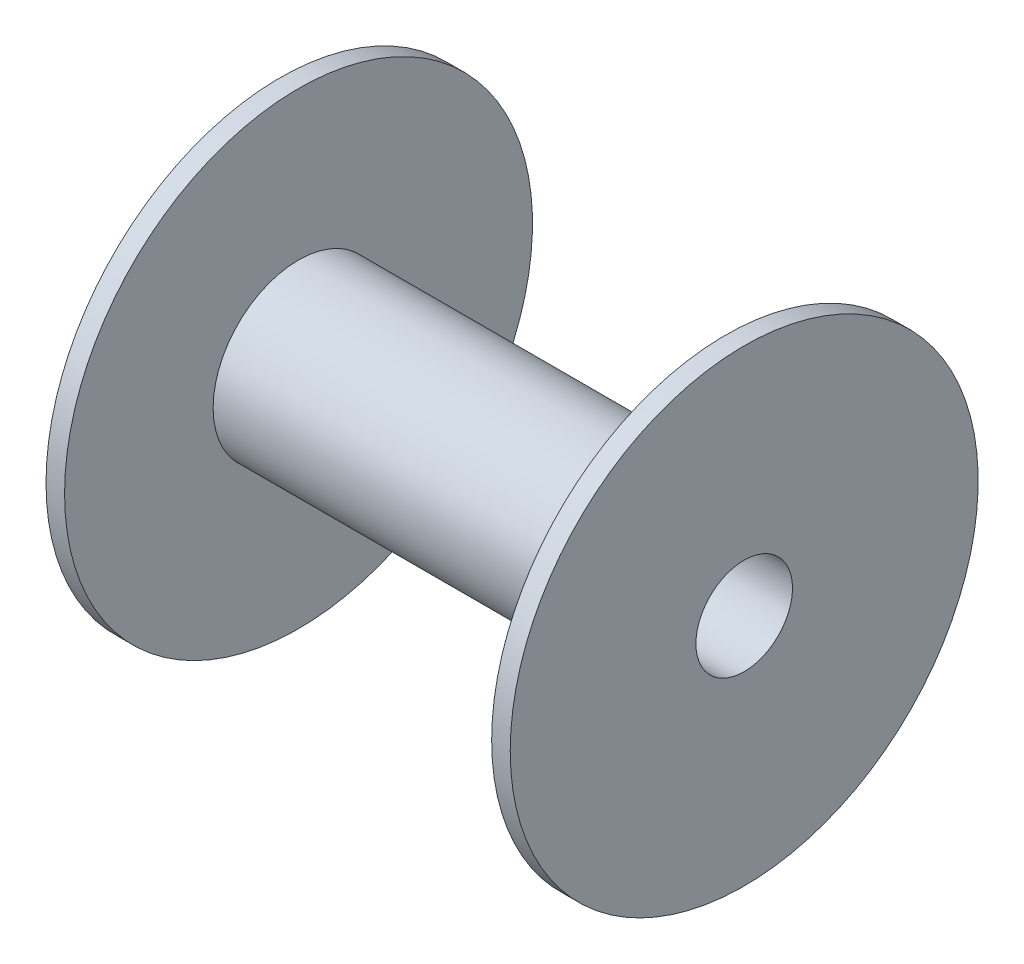
ISO-10303-21;
HEADER;
FILE_DESCRIPTION(('STEP AP214'),'2;1');
FILE_NAME('part.step','',(''),(''),'','','');
FILE_SCHEMA(('AUTOMOTIVE_DESIGN { 1 0 10303 214 1 1 1 1 }'));
ENDSEC;
DATA;
#1=APPLICATION_CONTEXT('core data for automotive mechanical design processes');
#2=APPLICATION_PROTOCOL_DEFINITION('international standard','automotive_design',2000,#1);
#3=PRODUCT_CONTEXT('',#1,'mechanical');
#4=PRODUCT('Part','Part','',(#3));
#5=PRODUCT_RELATED_PRODUCT_CATEGORY('part','',(#4));
#6=PRODUCT_DEFINITION_FORMATION('','',#4);
#7=PRODUCT_DEFINITION_CONTEXT('part definition',#1,'design');
#8=PRODUCT_DEFINITION('design','',#6,#7);
#9=PRODUCT_DEFINITION_SHAPE('','',#8);
#10=(LENGTH_UNIT() NAMED_UNIT(*) SI_UNIT(.MILLI.,.METRE.));
#11=(NAMED_UNIT(*) PLANE_ANGLE_UNIT() SI_UNIT($,.RADIAN.));
#12=(NAMED_UNIT(*) SI_UNIT($,.STERADIAN.) SOLID_ANGLE_UNIT());
#13=UNCERTAINTY_MEASURE_WITH_UNIT(LENGTH_MEASURE(1.E-05),#10,'distance_accuracy_value','');
#14=(GEOMETRIC_REPRESENTATION_CONTEXT(3) GLOBAL_UNCERTAINTY_ASSIGNED_CONTEXT((#13)) GLOBAL_UNIT_ASSIGNED_CONTEXT((#10,
#11,#12)) REPRESENTATION_CONTEXT('',''));
#15=CARTESIAN_POINT('',(0.,0.,0.));
#16=DIRECTION('',(0.,0.,1.));
#17=DIRECTION('',(1.,0.,0.));
#18=AXIS2_PLACEMENT_3D('',#15,#16,#17);
#19=CARTESIAN_POINT('',(-62.5,63.,0.));
#20=DIRECTION('',(1.,0.,0.));
#21=DIRECTION('',(0.,0.,-1.));
#22=AXIS2_PLACEMENT_3D('',#19,#20,#21);
#23=PLANE('',#22);
#24=CARTESIAN_POINT('',(-62.5,0.,0.));
#25=DIRECTION('',(-1.,0.,0.));
#26=DIRECTION('',(0.,0.,1.));
#27=AXIS2_PLACEMENT_3D('',#24,#25,#26);
#28=CIRCLE('',#27,13.);
#29=CARTESIAN_POINT('',(-62.5,0.,13.));
#30=VERTEX_POINT('',#29);
#31=EDGE_CURVE('E10',#30,#30,#28,.T.);
#32=ORIENTED_EDGE('',*,*,#31,.F.);
#33=EDGE_LOOP('',(#32));
#34=FACE_BOUND('',#33,.T.);
#35=CARTESIAN_POINT('',(-62.5,0.,0.));
#36=DIRECTION('',(-1.,0.,0.));
#37=DIRECTION('',(0.,0.,1.));
#38=AXIS2_PLACEMENT_3D('',#35,#36,#37);
#39=CIRCLE('',#38,63.);
#40=CARTESIAN_POINT('',(-62.5,0.,63.));
#41=VERTEX_POINT('',#40);
#42=EDGE_CURVE('E80',#41,#41,#39,.T.);
#43=ORIENTED_EDGE('',*,*,#42,.T.);
#44=EDGE_LOOP('',(#43));
#45=FACE_BOUND('',#44,.T.);
#46=ADVANCED_FACE('F43',(#34,#45),#23,.F.);
#47=CARTESIAN_POINT('',(-75.,0.,0.));
#48=DIRECTION('',(-1.,0.,0.));
#49=DIRECTION('',(0.,0.,1.));
#50=AXIS2_PLACEMENT_3D('',#47,#48,#49);
#51=CYLINDRICAL_SURFACE('',#50,13.);
#52=CARTESIAN_POINT('',(62.5,0.,0.));
#53=DIRECTION('',(-1.,0.,0.));
#54=DIRECTION('',(0.,0.,1.));
#55=AXIS2_PLACEMENT_3D('',#52,#53,#54);
#56=CIRCLE('',#55,13.);
#57=CARTESIAN_POINT('',(62.5,0.,13.));
#58=VERTEX_POINT('',#57);
#59=EDGE_CURVE('E49',#58,#58,#56,.T.);
#60=ORIENTED_EDGE('',*,*,#59,.F.);
#61=EDGE_LOOP('',(#60));
#62=FACE_BOUND('',#61,.T.);
#63=ORIENTED_EDGE('',*,*,#31,.T.);
#64=EDGE_LOOP('',(#63));
#65=FACE_BOUND('',#64,.T.);
#66=ADVANCED_FACE('F119',(#62,#65),#51,.F.);
#67=CARTESIAN_POINT('',(62.5,13.,0.));
#68=DIRECTION('',(-1.,0.,0.));
#69=DIRECTION('',(0.,0.,1.));
#70=AXIS2_PLACEMENT_3D('',#67,#68,#69);
#71=PLANE('',#70);
#72=CARTESIAN_POINT('',(62.5,0.,0.));
#73=DIRECTION('',(-1.,0.,0.));
#74=DIRECTION('',(0.,0.,1.));
#75=AXIS2_PLACEMENT_3D('',#72,#73,#74);
#76=CIRCLE('',#75,63.);
#77=CARTESIAN_POINT('',(62.5,0.,63.));
#78=VERTEX_POINT('',#77);
#79=EDGE_CURVE('E54',#78,#78,#76,.T.);
#80=ORIENTED_EDGE('',*,*,#79,.F.);
#81=EDGE_LOOP('',(#80));
#82=FACE_BOUND('',#81,.T.);
#83=ORIENTED_EDGE('',*,*,#59,.T.);
#84=EDGE_LOOP('',(#83));
#85=FACE_BOUND('',#84,.T.);
#86=ADVANCED_FACE('F112',(#82,#85),#71,.F.);
#87=CARTESIAN_POINT('',(-75.,0.,0.));
#88=DIRECTION('',(-1.,0.,0.));
#89=DIRECTION('',(0.,0.,1.));
#90=AXIS2_PLACEMENT_3D('',#87,#88,#89);
#91=CYLINDRICAL_SURFACE('',#90,63.);
#92=CARTESIAN_POINT('',(57.5,0.,0.));
#93=DIRECTION('',(-1.,0.,0.));
#94=DIRECTION('',(0.,0.,1.));
#95=AXIS2_PLACEMENT_3D('',#92,#93,#94);
#96=CIRCLE('',#95,63.);
#97=CARTESIAN_POINT('',(57.5,0.,63.));
#98=VERTEX_POINT('',#97);
#99=EDGE_CURVE('E58',#98,#98,#96,.T.);
#100=ORIENTED_EDGE('',*,*,#99,.F.);
#101=EDGE_LOOP('',(#100));
#102=FACE_BOUND('',#101,.T.);
#103=ORIENTED_EDGE('',*,*,#79,.T.);
#104=EDGE_LOOP('',(#103));
#105=FACE_BOUND('',#104,.T.);
#106=ADVANCED_FACE('F104',(#102,#105),#91,.T.);
#107=CARTESIAN_POINT('',(57.5,63.,0.));
#108=DIRECTION('',(1.,0.,0.));
#109=DIRECTION('',(0.,0.,-1.));
#110=AXIS2_PLACEMENT_3D('',#107,#108,#109);
#111=PLANE('',#110);
#112=CARTESIAN_POINT('',(57.5,0.,0.));
#113=DIRECTION('',(-1.,0.,0.));
#114=DIRECTION('',(0.,0.,1.));
#115=AXIS2_PLACEMENT_3D('',#112,#113,#114);
#116=CIRCLE('',#115,23.);
#117=CARTESIAN_POINT('',(57.5,0.,23.));
#118=VERTEX_POINT('',#117);
#119=EDGE_CURVE('E68',#118,#118,#116,.T.);
#120=ORIENTED_EDGE('',*,*,#119,.F.);
#121=EDGE_LOOP('',(#120));
#122=FACE_BOUND('',#121,.T.);
#123=ORIENTED_EDGE('',*,*,#99,.T.);
#124=EDGE_LOOP('',(#123));
#125=FACE_BOUND('',#124,.T.);
#126=ADVANCED_FACE('F97',(#122,#125),#111,.F.);
#127=CARTESIAN_POINT('',(-75.,0.,0.));
#128=DIRECTION('',(-1.,0.,0.));
#129=DIRECTION('',(0.,0.,1.));
#130=AXIS2_PLACEMENT_3D('',#127,#128,#129);
#131=CYLINDRICAL_SURFACE('',#130,23.);
#132=CARTESIAN_POINT('',(-57.5,0.,0.));
#133=DIRECTION('',(-1.,0.,0.));
#134=DIRECTION('',(0.,0.,1.));
#135=AXIS2_PLACEMENT_3D('',#132,#133,#134);
#136=CIRCLE('',#135,23.);
#137=CARTESIAN_POINT('',(-57.5,0.,23.));
#138=VERTEX_POINT('',#137);
#139=EDGE_CURVE('E66',#138,#138,#136,.T.);
#140=ORIENTED_EDGE('',*,*,#139,.F.);
#141=EDGE_LOOP('',(#140));
#142=FACE_BOUND('',#141,.T.);
#143=ORIENTED_EDGE('',*,*,#119,.T.);
#144=EDGE_LOOP('',(#143));
#145=FACE_BOUND('',#144,.T.);
#146=ADVANCED_FACE('F91',(#142,#145),#131,.T.);
#147=CARTESIAN_POINT('',(-57.5,63.,0.));
#148=DIRECTION('',(-1.,0.,0.));
#149=DIRECTION('',(0.,0.,1.));
#150=AXIS2_PLACEMENT_3D('',#147,#148,#149);
#151=PLANE('',#150);
#152=CARTESIAN_POINT('',(-57.5,0.,0.));
#153=DIRECTION('',(-1.,0.,0.));
#154=DIRECTION('',(0.,0.,1.));
#155=AXIS2_PLACEMENT_3D('',#152,#153,#154);
#156=CIRCLE('',#155,63.);
#157=CARTESIAN_POINT('',(-57.5,0.,63.));
#158=VERTEX_POINT('',#157);
#159=EDGE_CURVE('E74',#158,#158,#156,.T.);
#160=ORIENTED_EDGE('',*,*,#159,.F.);
#161=EDGE_LOOP('',(#160));
#162=FACE_BOUND('',#161,.T.);
#163=ORIENTED_EDGE('',*,*,#139,.T.);
#164=EDGE_LOOP('',(#163));
#165=FACE_BOUND('',#164,.T.);
#166=ADVANCED_FACE('F87',(#162,#165),#151,.F.);
#167=CARTESIAN_POINT('',(-75.,0.,0.));
#168=DIRECTION('',(-1.,0.,0.));
#169=DIRECTION('',(0.,0.,1.));
#170=AXIS2_PLACEMENT_3D('',#167,#168,#169);
#171=CYLINDRICAL_SURFACE('',#170,63.);
#172=ORIENTED_EDGE('',*,*,#42,.F.);
#173=EDGE_LOOP('',(#172));
#174=FACE_BOUND('',#173,.T.);
#175=ORIENTED_EDGE('',*,*,#159,.T.);
#176=EDGE_LOOP('',(#175));
#177=FACE_BOUND('',#176,.T.);
#178=ADVANCED_FACE('F85',(#174,#177),#171,.T.);
#179=CLOSED_SHELL('',(#46,#66,#86,#106,#126,#146,#166,#178));
#180=MANIFOLD_SOLID_BREP('B2',#179);
#181=ADVANCED_BREP_SHAPE_REPRESENTATION('',(#18,#180),#14);
#182=SHAPE_DEFINITION_REPRESENTATION(#9,#181);
ENDSEC;
END-ISO-10303-21;
